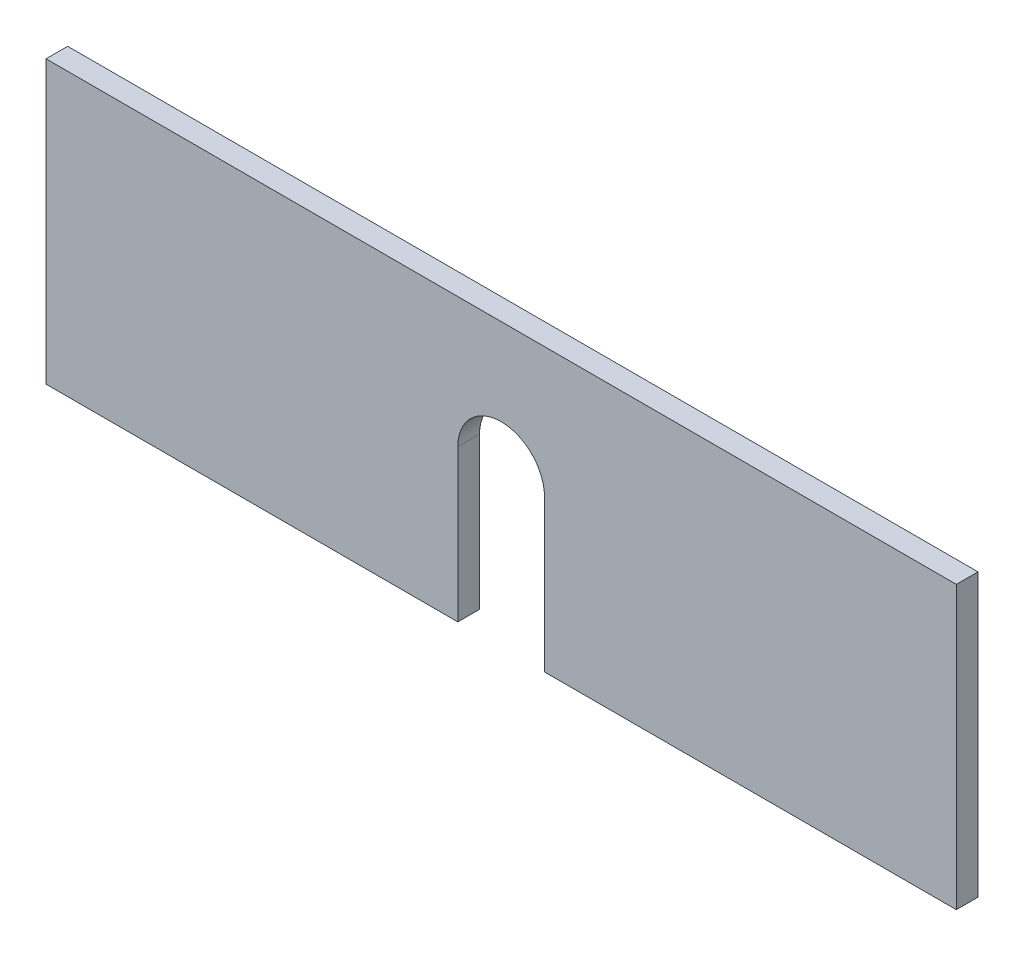
ISO-10303-21;
HEADER;
FILE_DESCRIPTION(('STEP AP214'),'2;1');
FILE_NAME('part.step','',(''),(''),'','','');
FILE_SCHEMA(('AUTOMOTIVE_DESIGN { 1 0 10303 214 1 1 1 1 }'));
ENDSEC;
DATA;
#1=APPLICATION_CONTEXT('core data for automotive mechanical design processes');
#2=APPLICATION_PROTOCOL_DEFINITION('international standard','automotive_design',2000,#1);
#3=PRODUCT_CONTEXT('',#1,'mechanical');
#4=PRODUCT('Part','Part','',(#3));
#5=PRODUCT_RELATED_PRODUCT_CATEGORY('part','',(#4));
#6=PRODUCT_DEFINITION_FORMATION('','',#4);
#7=PRODUCT_DEFINITION_CONTEXT('part definition',#1,'design');
#8=PRODUCT_DEFINITION('design','',#6,#7);
#9=PRODUCT_DEFINITION_SHAPE('','',#8);
#10=(LENGTH_UNIT() NAMED_UNIT(*) SI_UNIT(.MILLI.,.METRE.));
#11=(NAMED_UNIT(*) PLANE_ANGLE_UNIT() SI_UNIT($,.RADIAN.));
#12=(NAMED_UNIT(*) SI_UNIT($,.STERADIAN.) SOLID_ANGLE_UNIT());
#13=UNCERTAINTY_MEASURE_WITH_UNIT(LENGTH_MEASURE(1.E-05),#10,'distance_accuracy_value','');
#14=(GEOMETRIC_REPRESENTATION_CONTEXT(3) GLOBAL_UNCERTAINTY_ASSIGNED_CONTEXT((#13)) GLOBAL_UNIT_ASSIGNED_CONTEXT((#10,
#11,#12)) REPRESENTATION_CONTEXT('',''));
#15=CARTESIAN_POINT('',(0.,0.,0.));
#16=DIRECTION('',(0.,0.,1.));
#17=DIRECTION('',(1.,0.,0.));
#18=AXIS2_PLACEMENT_3D('',#15,#16,#17);
#19=CARTESIAN_POINT('',(-138.04780876494,32.7689243027889,5.));
#20=DIRECTION('',(1.,0.,0.));
#21=DIRECTION('',(0.,1.,0.));
#22=AXIS2_PLACEMENT_3D('',#19,#20,#21);
#23=PLANE('',#22);
#24=DIRECTION('',(0.,-1.,0.));
#25=VECTOR('',#24,1.);
#26=CARTESIAN_POINT('',(-138.04780876494,32.7689243027889,0.));
#27=LINE('',#26,#25);
#28=CARTESIAN_POINT('',(-138.04780876494,32.7689243027889,0.));
#29=VERTEX_POINT('',#28);
#30=CARTESIAN_POINT('',(-138.04780876494,-32.2310756972111,0.));
#31=VERTEX_POINT('',#30);
#32=EDGE_CURVE('E131',#29,#31,#27,.T.);
#33=ORIENTED_EDGE('',*,*,#32,.T.);
#34=DIRECTION('',(0.,0.,-1.));
#35=VECTOR('',#34,1.);
#36=CARTESIAN_POINT('',(-138.04780876494,-32.2310756972111,5.));
#37=LINE('',#36,#35);
#38=CARTESIAN_POINT('',(-138.04780876494,-32.2310756972111,5.));
#39=VERTEX_POINT('',#38);
#40=EDGE_CURVE('E11',#39,#31,#37,.T.);
#41=ORIENTED_EDGE('',*,*,#40,.F.);
#42=DIRECTION('',(0.,-1.,0.));
#43=VECTOR('',#42,1.);
#44=CARTESIAN_POINT('',(-138.04780876494,32.7689243027889,5.));
#45=LINE('',#44,#43);
#46=CARTESIAN_POINT('',(-138.04780876494,32.7689243027889,5.));
#47=VERTEX_POINT('',#46);
#48=EDGE_CURVE('E145',#47,#39,#45,.T.);
#49=ORIENTED_EDGE('',*,*,#48,.F.);
#50=DIRECTION('',(0.,0.,-1.));
#51=VECTOR('',#50,1.);
#52=CARTESIAN_POINT('',(-138.04780876494,32.7689243027889,5.));
#53=LINE('',#52,#51);
#54=EDGE_CURVE('E127',#47,#29,#53,.T.);
#55=ORIENTED_EDGE('',*,*,#54,.T.);
#56=EDGE_LOOP('',(#33,#41,#49,#55));
#57=FACE_BOUND('',#56,.T.);
#58=ADVANCED_FACE('F35',(#57),#23,.F.);
#59=CARTESIAN_POINT('',(-138.04780876494,-32.2310756972111,5.));
#60=DIRECTION('',(0.,1.,0.));
#61=DIRECTION('',(0.,0.,1.));
#62=AXIS2_PLACEMENT_3D('',#59,#60,#61);
#63=PLANE('',#62);
#64=DIRECTION('',(1.,0.,0.));
#65=VECTOR('',#64,1.);
#66=CARTESIAN_POINT('',(-138.04780876494,-32.2310756972111,0.));
#67=LINE('',#66,#65);
#68=CARTESIAN_POINT('',(-43.0478087649403,-32.2310756972111,0.));
#69=VERTEX_POINT('',#68);
#70=EDGE_CURVE('E134',#31,#69,#67,.T.);
#71=ORIENTED_EDGE('',*,*,#70,.T.);
#72=DIRECTION('',(0.,0.,-1.));
#73=VECTOR('',#72,1.);
#74=CARTESIAN_POINT('',(-43.0478087649403,-32.2310756972111,5.));
#75=LINE('',#74,#73);
#76=CARTESIAN_POINT('',(-43.0478087649403,-32.2310756972111,5.));
#77=VERTEX_POINT('',#76);
#78=EDGE_CURVE('E43',#77,#69,#75,.T.);
#79=ORIENTED_EDGE('',*,*,#78,.F.);
#80=DIRECTION('',(1.,0.,0.));
#81=VECTOR('',#80,1.);
#82=CARTESIAN_POINT('',(-138.04780876494,-32.2310756972111,5.));
#83=LINE('',#82,#81);
#84=EDGE_CURVE('E94',#39,#77,#83,.T.);
#85=ORIENTED_EDGE('',*,*,#84,.F.);
#86=ORIENTED_EDGE('',*,*,#40,.T.);
#87=EDGE_LOOP('',(#71,#79,#85,#86));
#88=FACE_BOUND('',#87,.T.);
#89=ADVANCED_FACE('F180',(#88),#63,.F.);
#90=CARTESIAN_POINT('',(-43.0478087649403,2.7689243027889,5.));
#91=DIRECTION('',(-1.,0.,0.));
#92=DIRECTION('',(0.,0.,1.));
#93=AXIS2_PLACEMENT_3D('',#90,#91,#92);
#94=PLANE('',#93);
#95=DIRECTION('',(0.,1.,0.));
#96=VECTOR('',#95,1.);
#97=CARTESIAN_POINT('',(-43.0478087649403,2.7689243027889,0.));
#98=LINE('',#97,#96);
#99=CARTESIAN_POINT('',(-43.0478087649403,2.7689243027889,0.));
#100=VERTEX_POINT('',#99);
#101=EDGE_CURVE('E136',#69,#100,#98,.T.);
#102=ORIENTED_EDGE('',*,*,#101,.T.);
#103=DIRECTION('',(0.,0.,-1.));
#104=VECTOR('',#103,1.);
#105=CARTESIAN_POINT('',(-43.0478087649403,2.7689243027889,5.));
#106=LINE('',#105,#104);
#107=CARTESIAN_POINT('',(-43.0478087649403,2.7689243027889,5.));
#108=VERTEX_POINT('',#107);
#109=EDGE_CURVE('E152',#108,#100,#106,.T.);
#110=ORIENTED_EDGE('',*,*,#109,.F.);
#111=DIRECTION('',(0.,1.,0.));
#112=VECTOR('',#111,1.);
#113=CARTESIAN_POINT('',(-43.0478087649403,2.7689243027889,5.));
#114=LINE('',#113,#112);
#115=EDGE_CURVE('E160',#77,#108,#114,.T.);
#116=ORIENTED_EDGE('',*,*,#115,.F.);
#117=ORIENTED_EDGE('',*,*,#78,.T.);
#118=EDGE_LOOP('',(#102,#110,#116,#117));
#119=FACE_BOUND('',#118,.T.);
#120=ADVANCED_FACE('F158',(#119),#94,.F.);
#121=CARTESIAN_POINT('',(-33.0478087649403,2.7689243027889,5.));
#122=DIRECTION('',(0.,0.,-1.));
#123=DIRECTION('',(-1.,0.,0.));
#124=AXIS2_PLACEMENT_3D('',#121,#122,#123);
#125=CYLINDRICAL_SURFACE('',#124,10.);
#126=CARTESIAN_POINT('',(-33.0478087649403,2.7689243027889,0.));
#127=DIRECTION('',(0.,0.,-1.));
#128=DIRECTION('',(1.,0.,0.));
#129=AXIS2_PLACEMENT_3D('',#126,#127,#128);
#130=CIRCLE('',#129,10.);
#131=CARTESIAN_POINT('',(-23.0478087649403,2.7689243027889,0.));
#132=VERTEX_POINT('',#131);
#133=EDGE_CURVE('E138',#100,#132,#130,.T.);
#134=ORIENTED_EDGE('',*,*,#133,.T.);
#135=DIRECTION('',(0.,0.,-1.));
#136=VECTOR('',#135,1.);
#137=CARTESIAN_POINT('',(-23.0478087649403,2.7689243027889,5.));
#138=LINE('',#137,#136);
#139=CARTESIAN_POINT('',(-23.0478087649403,2.7689243027889,5.));
#140=VERTEX_POINT('',#139);
#141=EDGE_CURVE('E149',#140,#132,#138,.T.);
#142=ORIENTED_EDGE('',*,*,#141,.F.);
#143=CARTESIAN_POINT('',(-33.0478087649403,2.7689243027889,5.));
#144=DIRECTION('',(0.,0.,-1.));
#145=DIRECTION('',(1.,0.,0.));
#146=AXIS2_PLACEMENT_3D('',#143,#144,#145);
#147=CIRCLE('',#146,10.);
#148=EDGE_CURVE('E172',#108,#140,#147,.T.);
#149=ORIENTED_EDGE('',*,*,#148,.F.);
#150=ORIENTED_EDGE('',*,*,#109,.T.);
#151=EDGE_LOOP('',(#134,#142,#149,#150));
#152=FACE_BOUND('',#151,.T.);
#153=ADVANCED_FACE('F168',(#152),#125,.F.);
#154=CARTESIAN_POINT('',(-23.0478087649403,2.7689243027889,5.));
#155=DIRECTION('',(1.,0.,0.));
#156=DIRECTION('',(0.,1.,0.));
#157=AXIS2_PLACEMENT_3D('',#154,#155,#156);
#158=PLANE('',#157);
#159=DIRECTION('',(0.,-1.,0.));
#160=VECTOR('',#159,1.);
#161=CARTESIAN_POINT('',(-23.0478087649403,2.7689243027889,0.));
#162=LINE('',#161,#160);
#163=CARTESIAN_POINT('',(-23.0478087649403,-32.2310756972111,0.));
#164=VERTEX_POINT('',#163);
#165=EDGE_CURVE('E140',#132,#164,#162,.T.);
#166=ORIENTED_EDGE('',*,*,#165,.T.);
#167=DIRECTION('',(0.,0.,-1.));
#168=VECTOR('',#167,1.);
#169=CARTESIAN_POINT('',(-23.0478087649403,-32.2310756972111,5.));
#170=LINE('',#169,#168);
#171=CARTESIAN_POINT('',(-23.0478087649403,-32.2310756972111,5.));
#172=VERTEX_POINT('',#171);
#173=EDGE_CURVE('E122',#172,#164,#170,.T.);
#174=ORIENTED_EDGE('',*,*,#173,.F.);
#175=DIRECTION('',(0.,-1.,0.));
#176=VECTOR('',#175,1.);
#177=CARTESIAN_POINT('',(-23.0478087649403,2.7689243027889,5.));
#178=LINE('',#177,#176);
#179=EDGE_CURVE('E113',#140,#172,#178,.T.);
#180=ORIENTED_EDGE('',*,*,#179,.F.);
#181=ORIENTED_EDGE('',*,*,#141,.T.);
#182=EDGE_LOOP('',(#166,#174,#180,#181));
#183=FACE_BOUND('',#182,.T.);
#184=ADVANCED_FACE('F171',(#183),#158,.F.);
#185=CARTESIAN_POINT('',(-23.0478087649403,-32.2310756972111,5.));
#186=DIRECTION('',(0.,1.,0.));
#187=DIRECTION('',(0.,0.,1.));
#188=AXIS2_PLACEMENT_3D('',#185,#186,#187);
#189=PLANE('',#188);
#190=DIRECTION('',(1.,0.,0.));
#191=VECTOR('',#190,1.);
#192=CARTESIAN_POINT('',(-23.0478087649403,-32.2310756972111,0.));
#193=LINE('',#192,#191);
#194=CARTESIAN_POINT('',(71.9521912350598,-32.2310756972111,0.));
#195=VERTEX_POINT('',#194);
#196=EDGE_CURVE('E121',#164,#195,#193,.T.);
#197=ORIENTED_EDGE('',*,*,#196,.T.);
#198=DIRECTION('',(0.,0.,-1.));
#199=VECTOR('',#198,1.);
#200=CARTESIAN_POINT('',(71.9521912350598,-32.2310756972111,5.));
#201=LINE('',#200,#199);
#202=CARTESIAN_POINT('',(71.9521912350598,-32.2310756972111,5.));
#203=VERTEX_POINT('',#202);
#204=EDGE_CURVE('E118',#203,#195,#201,.T.);
#205=ORIENTED_EDGE('',*,*,#204,.F.);
#206=DIRECTION('',(1.,0.,0.));
#207=VECTOR('',#206,1.);
#208=CARTESIAN_POINT('',(-23.0478087649403,-32.2310756972111,5.));
#209=LINE('',#208,#207);
#210=EDGE_CURVE('E107',#172,#203,#209,.T.);
#211=ORIENTED_EDGE('',*,*,#210,.F.);
#212=ORIENTED_EDGE('',*,*,#173,.T.);
#213=EDGE_LOOP('',(#197,#205,#211,#212));
#214=FACE_BOUND('',#213,.T.);
#215=ADVANCED_FACE('F119',(#214),#189,.F.);
#216=CARTESIAN_POINT('',(71.9521912350597,32.7689243027889,5.));
#217=DIRECTION('',(-1.,0.,0.));
#218=DIRECTION('',(0.,-1.,0.));
#219=AXIS2_PLACEMENT_3D('',#216,#217,#218);
#220=PLANE('',#219);
#221=DIRECTION('',(0.,1.,0.));
#222=VECTOR('',#221,1.);
#223=CARTESIAN_POINT('',(71.9521912350597,32.7689243027889,0.));
#224=LINE('',#223,#222);
#225=CARTESIAN_POINT('',(71.9521912350597,32.7689243027889,0.));
#226=VERTEX_POINT('',#225);
#227=EDGE_CURVE('E80',#195,#226,#224,.T.);
#228=ORIENTED_EDGE('',*,*,#227,.T.);
#229=DIRECTION('',(0.,0.,-1.));
#230=VECTOR('',#229,1.);
#231=CARTESIAN_POINT('',(71.9521912350597,32.7689243027889,5.));
#232=LINE('',#231,#230);
#233=CARTESIAN_POINT('',(71.9521912350597,32.7689243027889,5.));
#234=VERTEX_POINT('',#233);
#235=EDGE_CURVE('E123',#234,#226,#232,.T.);
#236=ORIENTED_EDGE('',*,*,#235,.F.);
#237=DIRECTION('',(0.,1.,0.));
#238=VECTOR('',#237,1.);
#239=CARTESIAN_POINT('',(71.9521912350597,32.7689243027889,5.));
#240=LINE('',#239,#238);
#241=EDGE_CURVE('E111',#203,#234,#240,.T.);
#242=ORIENTED_EDGE('',*,*,#241,.F.);
#243=ORIENTED_EDGE('',*,*,#204,.T.);
#244=EDGE_LOOP('',(#228,#236,#242,#243));
#245=FACE_BOUND('',#244,.T.);
#246=ADVANCED_FACE('F125',(#245),#220,.F.);
#247=CARTESIAN_POINT('',(-138.04780876494,32.7689243027889,5.));
#248=DIRECTION('',(0.,-1.,0.));
#249=DIRECTION('',(0.,0.,-1.));
#250=AXIS2_PLACEMENT_3D('',#247,#248,#249);
#251=PLANE('',#250);
#252=DIRECTION('',(-1.,0.,0.));
#253=VECTOR('',#252,1.);
#254=CARTESIAN_POINT('',(-138.04780876494,32.7689243027889,0.));
#255=LINE('',#254,#253);
#256=EDGE_CURVE('E86',#226,#29,#255,.T.);
#257=ORIENTED_EDGE('',*,*,#256,.T.);
#258=ORIENTED_EDGE('',*,*,#54,.F.);
#259=DIRECTION('',(-1.,0.,0.));
#260=VECTOR('',#259,1.);
#261=CARTESIAN_POINT('',(-138.04780876494,32.7689243027889,5.));
#262=LINE('',#261,#260);
#263=EDGE_CURVE('E51',#234,#47,#262,.T.);
#264=ORIENTED_EDGE('',*,*,#263,.F.);
#265=ORIENTED_EDGE('',*,*,#235,.T.);
#266=EDGE_LOOP('',(#257,#258,#264,#265));
#267=FACE_BOUND('',#266,.T.);
#268=ADVANCED_FACE('F196',(#267),#251,.F.);
#269=CARTESIAN_POINT('',(-33.0478087649403,2.7689243027889,5.));
#270=DIRECTION('',(0.,0.,1.));
#271=DIRECTION('',(1.,0.,0.));
#272=AXIS2_PLACEMENT_3D('',#269,#270,#271);
#273=PLANE('',#272);
#274=ORIENTED_EDGE('',*,*,#48,.T.);
#275=ORIENTED_EDGE('',*,*,#84,.T.);
#276=ORIENTED_EDGE('',*,*,#115,.T.);
#277=ORIENTED_EDGE('',*,*,#148,.T.);
#278=ORIENTED_EDGE('',*,*,#179,.T.);
#279=ORIENTED_EDGE('',*,*,#210,.T.);
#280=ORIENTED_EDGE('',*,*,#241,.T.);
#281=ORIENTED_EDGE('',*,*,#263,.T.);
#282=EDGE_LOOP('',(#274,#275,#276,#277,#278,#279,#280,#281));
#283=FACE_BOUND('',#282,.T.);
#284=ADVANCED_FACE('F109',(#283),#273,.T.);
#285=CARTESIAN_POINT('',(-33.0478087649403,2.7689243027889,0.));
#286=DIRECTION('',(0.,0.,1.));
#287=DIRECTION('',(1.,0.,0.));
#288=AXIS2_PLACEMENT_3D('',#285,#286,#287);
#289=PLANE('',#288);
#290=ORIENTED_EDGE('',*,*,#32,.F.);
#291=ORIENTED_EDGE('',*,*,#256,.F.);
#292=ORIENTED_EDGE('',*,*,#227,.F.);
#293=ORIENTED_EDGE('',*,*,#196,.F.);
#294=ORIENTED_EDGE('',*,*,#165,.F.);
#295=ORIENTED_EDGE('',*,*,#133,.F.);
#296=ORIENTED_EDGE('',*,*,#101,.F.);
#297=ORIENTED_EDGE('',*,*,#70,.F.);
#298=EDGE_LOOP('',(#290,#291,#292,#293,#294,#295,#296,#297));
#299=FACE_BOUND('',#298,.T.);
#300=ADVANCED_FACE('F164',(#299),#289,.F.);
#301=CLOSED_SHELL('',(#58,#89,#120,#153,#184,#215,#246,#268,#284,#300));
#302=MANIFOLD_SOLID_BREP('B2',#301);
#303=ADVANCED_BREP_SHAPE_REPRESENTATION('',(#18,#302),#14);
#304=SHAPE_DEFINITION_REPRESENTATION(#9,#303);
ENDSEC;
END-ISO-10303-21;
